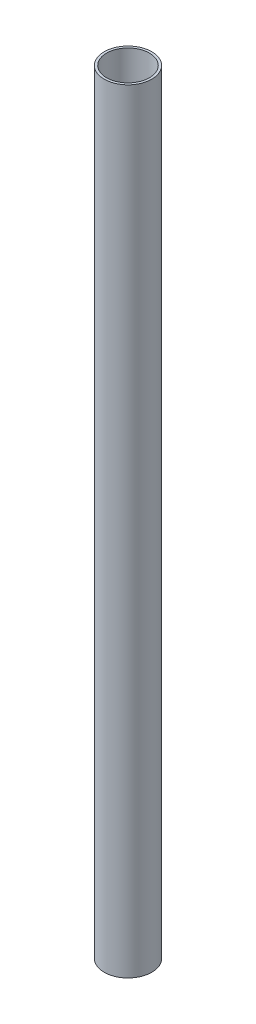
ISO-10303-21;
HEADER;
FILE_DESCRIPTION(('STEP AP214'),'2;1');
FILE_NAME('part.step','',(''),(''),'','','');
FILE_SCHEMA(('AUTOMOTIVE_DESIGN { 1 0 10303 214 1 1 1 1 }'));
ENDSEC;
DATA;
#1=APPLICATION_CONTEXT('core data for automotive mechanical design processes');
#2=APPLICATION_PROTOCOL_DEFINITION('international standard','automotive_design',2000,#1);
#3=PRODUCT_CONTEXT('',#1,'mechanical');
#4=PRODUCT('Part','Part','',(#3));
#5=PRODUCT_RELATED_PRODUCT_CATEGORY('part','',(#4));
#6=PRODUCT_DEFINITION_FORMATION('','',#4);
#7=PRODUCT_DEFINITION_CONTEXT('part definition',#1,'design');
#8=PRODUCT_DEFINITION('design','',#6,#7);
#9=PRODUCT_DEFINITION_SHAPE('','',#8);
#10=(LENGTH_UNIT() NAMED_UNIT(*) SI_UNIT(.MILLI.,.METRE.));
#11=(NAMED_UNIT(*) PLANE_ANGLE_UNIT() SI_UNIT($,.RADIAN.));
#12=(NAMED_UNIT(*) SI_UNIT($,.STERADIAN.) SOLID_ANGLE_UNIT());
#13=UNCERTAINTY_MEASURE_WITH_UNIT(LENGTH_MEASURE(1.E-05),#10,'distance_accuracy_value','');
#14=(GEOMETRIC_REPRESENTATION_CONTEXT(3) GLOBAL_UNCERTAINTY_ASSIGNED_CONTEXT((#13)) GLOBAL_UNIT_ASSIGNED_CONTEXT((#10,
#11,#12)) REPRESENTATION_CONTEXT('',''));
#15=CARTESIAN_POINT('',(0.,0.,0.));
#16=DIRECTION('',(0.,0.,1.));
#17=DIRECTION('',(1.,0.,0.));
#18=AXIS2_PLACEMENT_3D('',#15,#16,#17);
#19=CARTESIAN_POINT('',(0.,325.,0.));
#20=DIRECTION('',(0.,1.,0.));
#21=DIRECTION('',(0.,0.,1.));
#22=AXIS2_PLACEMENT_3D('',#19,#20,#21);
#23=PLANE('',#22);
#24=CARTESIAN_POINT('',(0.,325.,0.));
#25=DIRECTION('',(0.,1.,0.));
#26=DIRECTION('',(0.,0.,1.));
#27=AXIS2_PLACEMENT_3D('',#24,#25,#26);
#28=CIRCLE('',#27,10.);
#29=CARTESIAN_POINT('',(0.,325.,10.));
#30=VERTEX_POINT('',#29);
#31=EDGE_CURVE('E10',#30,#30,#28,.T.);
#32=ORIENTED_EDGE('',*,*,#31,.T.);
#33=EDGE_LOOP('',(#32));
#34=FACE_BOUND('',#33,.T.);
#35=CARTESIAN_POINT('',(0.,325.,0.));
#36=DIRECTION('',(0.,1.,0.));
#37=DIRECTION('',(0.,0.,1.));
#38=AXIS2_PLACEMENT_3D('',#35,#36,#37);
#39=CIRCLE('',#38,9.);
#40=CARTESIAN_POINT('',(0.,325.,9.));
#41=VERTEX_POINT('',#40);
#42=EDGE_CURVE('E44',#41,#41,#39,.T.);
#43=ORIENTED_EDGE('',*,*,#42,.F.);
#44=EDGE_LOOP('',(#43));
#45=FACE_BOUND('',#44,.T.);
#46=ADVANCED_FACE('F33',(#34,#45),#23,.T.);
#47=CARTESIAN_POINT('',(0.,0.,0.));
#48=DIRECTION('',(0.,1.,0.));
#49=DIRECTION('',(0.,0.,1.));
#50=AXIS2_PLACEMENT_3D('',#47,#48,#49);
#51=PLANE('',#50);
#52=CARTESIAN_POINT('',(0.,0.,0.));
#53=DIRECTION('',(0.,1.,0.));
#54=DIRECTION('',(0.,0.,1.));
#55=AXIS2_PLACEMENT_3D('',#52,#53,#54);
#56=CIRCLE('',#55,10.);
#57=CARTESIAN_POINT('',(0.,0.,10.));
#58=VERTEX_POINT('',#57);
#59=EDGE_CURVE('E37',#58,#58,#56,.T.);
#60=ORIENTED_EDGE('',*,*,#59,.F.);
#61=EDGE_LOOP('',(#60));
#62=FACE_BOUND('',#61,.T.);
#63=CARTESIAN_POINT('',(0.,0.,0.));
#64=DIRECTION('',(0.,1.,0.));
#65=DIRECTION('',(0.,0.,1.));
#66=AXIS2_PLACEMENT_3D('',#63,#64,#65);
#67=CIRCLE('',#66,9.);
#68=CARTESIAN_POINT('',(0.,0.,9.));
#69=VERTEX_POINT('',#68);
#70=EDGE_CURVE('E46',#69,#69,#67,.T.);
#71=ORIENTED_EDGE('',*,*,#70,.T.);
#72=EDGE_LOOP('',(#71));
#73=FACE_BOUND('',#72,.T.);
#74=ADVANCED_FACE('F56',(#62,#73),#51,.F.);
#75=CARTESIAN_POINT('',(0.,325.,0.));
#76=DIRECTION('',(0.,-1.,0.));
#77=DIRECTION('',(0.,0.,-1.));
#78=AXIS2_PLACEMENT_3D('',#75,#76,#77);
#79=CYLINDRICAL_SURFACE('',#78,10.);
#80=ORIENTED_EDGE('',*,*,#31,.F.);
#81=EDGE_LOOP('',(#80));
#82=FACE_BOUND('',#81,.T.);
#83=ORIENTED_EDGE('',*,*,#59,.T.);
#84=EDGE_LOOP('',(#83));
#85=FACE_BOUND('',#84,.T.);
#86=ADVANCED_FACE('F35',(#82,#85),#79,.T.);
#87=CARTESIAN_POINT('',(0.,325.,0.));
#88=DIRECTION('',(0.,-1.,0.));
#89=DIRECTION('',(0.,0.,-1.));
#90=AXIS2_PLACEMENT_3D('',#87,#88,#89);
#91=CYLINDRICAL_SURFACE('',#90,9.);
#92=ORIENTED_EDGE('',*,*,#42,.T.);
#93=EDGE_LOOP('',(#92));
#94=FACE_BOUND('',#93,.T.);
#95=ORIENTED_EDGE('',*,*,#70,.F.);
#96=EDGE_LOOP('',(#95));
#97=FACE_BOUND('',#96,.T.);
#98=ADVANCED_FACE('F52',(#94,#97),#91,.F.);
#99=CLOSED_SHELL('',(#46,#74,#86,#98));
#100=MANIFOLD_SOLID_BREP('B2',#99);
#101=ADVANCED_BREP_SHAPE_REPRESENTATION('',(#18,#100),#14);
#102=SHAPE_DEFINITION_REPRESENTATION(#9,#101);
ENDSEC;
END-ISO-10303-21;
